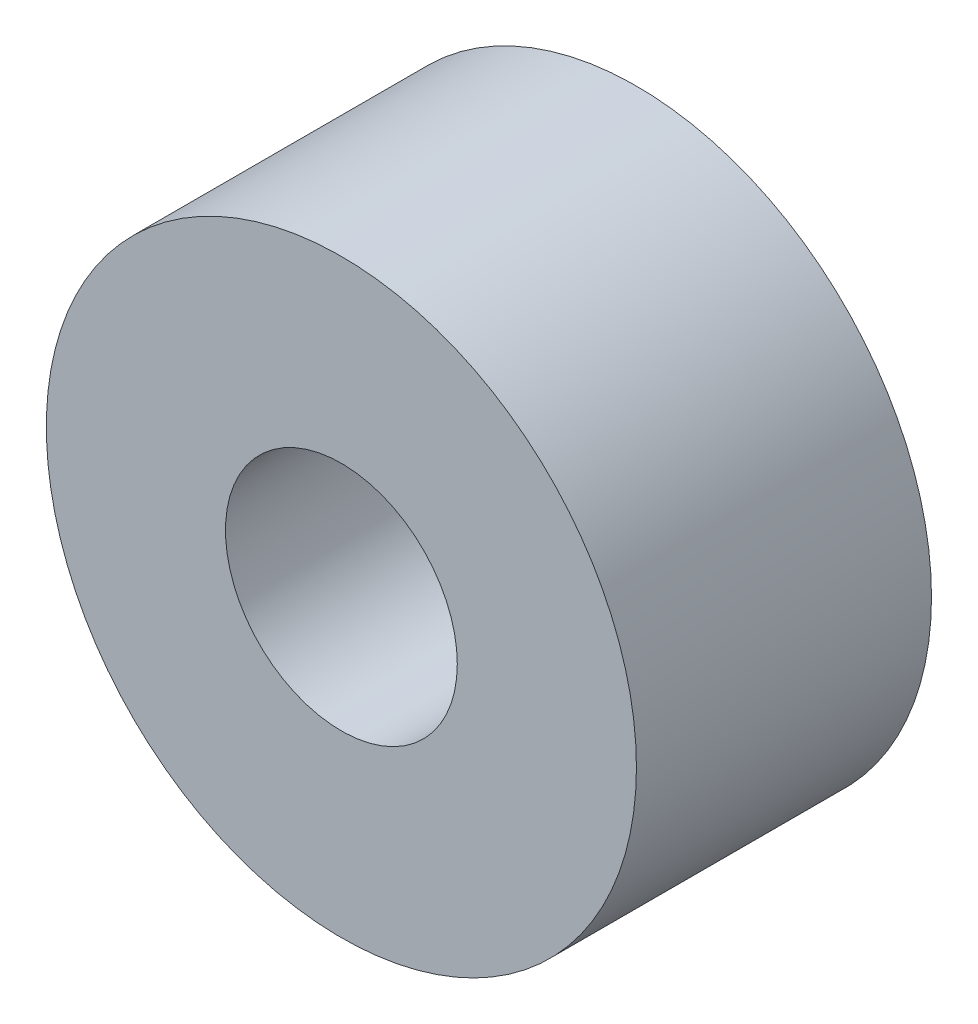
ISO-10303-21;
HEADER;
FILE_DESCRIPTION(('STEP AP214'),'2;1');
FILE_NAME('part.step','',(''),(''),'','','');
FILE_SCHEMA(('AUTOMOTIVE_DESIGN { 1 0 10303 214 1 1 1 1 }'));
ENDSEC;
DATA;
#1=APPLICATION_CONTEXT('core data for automotive mechanical design processes');
#2=APPLICATION_PROTOCOL_DEFINITION('international standard','automotive_design',2000,#1);
#3=PRODUCT_CONTEXT('',#1,'mechanical');
#4=PRODUCT('Part','Part','',(#3));
#5=PRODUCT_RELATED_PRODUCT_CATEGORY('part','',(#4));
#6=PRODUCT_DEFINITION_FORMATION('','',#4);
#7=PRODUCT_DEFINITION_CONTEXT('part definition',#1,'design');
#8=PRODUCT_DEFINITION('design','',#6,#7);
#9=PRODUCT_DEFINITION_SHAPE('','',#8);
#10=(LENGTH_UNIT() NAMED_UNIT(*) SI_UNIT(.MILLI.,.METRE.));
#11=(NAMED_UNIT(*) PLANE_ANGLE_UNIT() SI_UNIT($,.RADIAN.));
#12=(NAMED_UNIT(*) SI_UNIT($,.STERADIAN.) SOLID_ANGLE_UNIT());
#13=UNCERTAINTY_MEASURE_WITH_UNIT(LENGTH_MEASURE(1.E-05),#10,'distance_accuracy_value','');
#14=(GEOMETRIC_REPRESENTATION_CONTEXT(3) GLOBAL_UNCERTAINTY_ASSIGNED_CONTEXT((#13)) GLOBAL_UNIT_ASSIGNED_CONTEXT((#10,
#11,#12)) REPRESENTATION_CONTEXT('',''));
#15=CARTESIAN_POINT('',(0.,0.,0.));
#16=DIRECTION('',(0.,0.,1.));
#17=DIRECTION('',(1.,0.,0.));
#18=AXIS2_PLACEMENT_3D('',#15,#16,#17);
#19=CARTESIAN_POINT('',(0.,0.,14.));
#20=DIRECTION('',(0.,0.,1.));
#21=DIRECTION('',(1.,0.,0.));
#22=AXIS2_PLACEMENT_3D('',#19,#20,#21);
#23=PLANE('',#22);
#24=CARTESIAN_POINT('',(0.,0.,14.));
#25=DIRECTION('',(0.,0.,1.));
#26=DIRECTION('',(1.,0.,0.));
#27=AXIS2_PLACEMENT_3D('',#24,#25,#26);
#28=CIRCLE('',#27,14.);
#29=CARTESIAN_POINT('',(14.,0.,14.));
#30=VERTEX_POINT('',#29);
#31=EDGE_CURVE('E10',#30,#30,#28,.T.);
#32=ORIENTED_EDGE('',*,*,#31,.T.);
#33=EDGE_LOOP('',(#32));
#34=FACE_BOUND('',#33,.T.);
#35=CARTESIAN_POINT('',(0.,0.,14.));
#36=DIRECTION('',(0.,0.,1.));
#37=DIRECTION('',(1.,0.,0.));
#38=AXIS2_PLACEMENT_3D('',#35,#36,#37);
#39=CIRCLE('',#38,5.5);
#40=CARTESIAN_POINT('',(5.5,0.,14.));
#41=VERTEX_POINT('',#40);
#42=EDGE_CURVE('E43',#41,#41,#39,.T.);
#43=ORIENTED_EDGE('',*,*,#42,.F.);
#44=EDGE_LOOP('',(#43));
#45=FACE_BOUND('',#44,.T.);
#46=ADVANCED_FACE('F32',(#34,#45),#23,.T.);
#47=CARTESIAN_POINT('',(0.,0.,0.));
#48=DIRECTION('',(0.,0.,1.));
#49=DIRECTION('',(1.,0.,0.));
#50=AXIS2_PLACEMENT_3D('',#47,#48,#49);
#51=PLANE('',#50);
#52=CARTESIAN_POINT('',(0.,0.,0.));
#53=DIRECTION('',(0.,0.,1.));
#54=DIRECTION('',(1.,0.,0.));
#55=AXIS2_PLACEMENT_3D('',#52,#53,#54);
#56=CIRCLE('',#55,14.);
#57=CARTESIAN_POINT('',(14.,0.,0.));
#58=VERTEX_POINT('',#57);
#59=EDGE_CURVE('E36',#58,#58,#56,.T.);
#60=ORIENTED_EDGE('',*,*,#59,.F.);
#61=EDGE_LOOP('',(#60));
#62=FACE_BOUND('',#61,.T.);
#63=CARTESIAN_POINT('',(0.,0.,0.));
#64=DIRECTION('',(0.,0.,1.));
#65=DIRECTION('',(1.,0.,0.));
#66=AXIS2_PLACEMENT_3D('',#63,#64,#65);
#67=CIRCLE('',#66,5.5);
#68=CARTESIAN_POINT('',(5.5,0.,0.));
#69=VERTEX_POINT('',#68);
#70=EDGE_CURVE('E45',#69,#69,#67,.T.);
#71=ORIENTED_EDGE('',*,*,#70,.T.);
#72=EDGE_LOOP('',(#71));
#73=FACE_BOUND('',#72,.T.);
#74=ADVANCED_FACE('F55',(#62,#73),#51,.F.);
#75=CARTESIAN_POINT('',(0.,0.,14.));
#76=DIRECTION('',(0.,0.,-1.));
#77=DIRECTION('',(-1.,0.,0.));
#78=AXIS2_PLACEMENT_3D('',#75,#76,#77);
#79=CYLINDRICAL_SURFACE('',#78,14.);
#80=ORIENTED_EDGE('',*,*,#31,.F.);
#81=EDGE_LOOP('',(#80));
#82=FACE_BOUND('',#81,.T.);
#83=ORIENTED_EDGE('',*,*,#59,.T.);
#84=EDGE_LOOP('',(#83));
#85=FACE_BOUND('',#84,.T.);
#86=ADVANCED_FACE('F34',(#82,#85),#79,.T.);
#87=CARTESIAN_POINT('',(0.,0.,14.));
#88=DIRECTION('',(0.,0.,-1.));
#89=DIRECTION('',(-1.,0.,0.));
#90=AXIS2_PLACEMENT_3D('',#87,#88,#89);
#91=CYLINDRICAL_SURFACE('',#90,5.5);
#92=ORIENTED_EDGE('',*,*,#42,.T.);
#93=EDGE_LOOP('',(#92));
#94=FACE_BOUND('',#93,.T.);
#95=ORIENTED_EDGE('',*,*,#70,.F.);
#96=EDGE_LOOP('',(#95));
#97=FACE_BOUND('',#96,.T.);
#98=ADVANCED_FACE('F51',(#94,#97),#91,.F.);
#99=CLOSED_SHELL('',(#46,#74,#86,#98));
#100=MANIFOLD_SOLID_BREP('B2',#99);
#101=ADVANCED_BREP_SHAPE_REPRESENTATION('',(#18,#100),#14);
#102=SHAPE_DEFINITION_REPRESENTATION(#9,#101);
ENDSEC;
END-ISO-10303-21;
